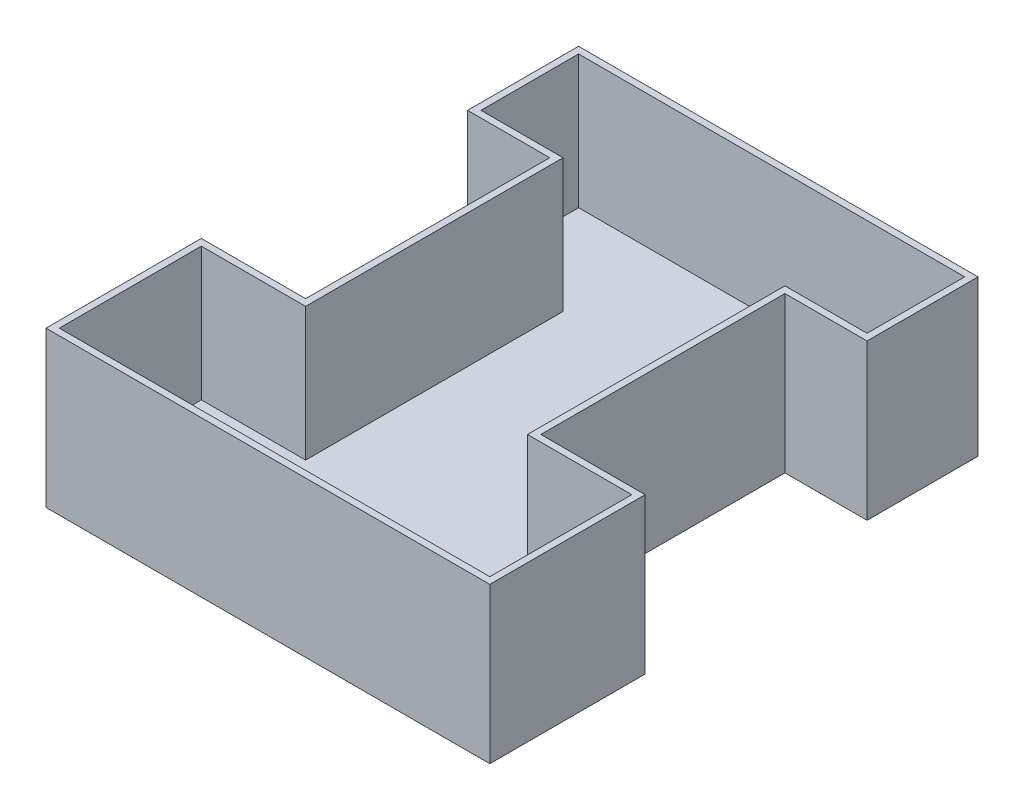
ISO-10303-21;
HEADER;
FILE_DESCRIPTION(('STEP AP214'),'2;1');
FILE_NAME('part.step','',(''),(''),'','','');
FILE_SCHEMA(('AUTOMOTIVE_DESIGN { 1 0 10303 214 1 1 1 1 }'));
ENDSEC;
DATA;
#1=APPLICATION_CONTEXT('core data for automotive mechanical design processes');
#2=APPLICATION_PROTOCOL_DEFINITION('international standard','automotive_design',2000,#1);
#3=PRODUCT_CONTEXT('',#1,'mechanical');
#4=PRODUCT('Part','Part','',(#3));
#5=PRODUCT_RELATED_PRODUCT_CATEGORY('part','',(#4));
#6=PRODUCT_DEFINITION_FORMATION('','',#4);
#7=PRODUCT_DEFINITION_CONTEXT('part definition',#1,'design');
#8=PRODUCT_DEFINITION('design','',#6,#7);
#9=PRODUCT_DEFINITION_SHAPE('','',#8);
#10=(LENGTH_UNIT() NAMED_UNIT(*) SI_UNIT(.MILLI.,.METRE.));
#11=(NAMED_UNIT(*) PLANE_ANGLE_UNIT() SI_UNIT($,.RADIAN.));
#12=(NAMED_UNIT(*) SI_UNIT($,.STERADIAN.) SOLID_ANGLE_UNIT());
#13=UNCERTAINTY_MEASURE_WITH_UNIT(LENGTH_MEASURE(1.E-05),#10,'distance_accuracy_value','');
#14=(GEOMETRIC_REPRESENTATION_CONTEXT(3) GLOBAL_UNCERTAINTY_ASSIGNED_CONTEXT((#13)) GLOBAL_UNIT_ASSIGNED_CONTEXT((#10,
#11,#12)) REPRESENTATION_CONTEXT('',''));
#15=CARTESIAN_POINT('',(0.,0.,0.));
#16=DIRECTION('',(0.,0.,1.));
#17=DIRECTION('',(1.,0.,0.));
#18=AXIS2_PLACEMENT_3D('',#15,#16,#17);
#19=CARTESIAN_POINT('',(0.,60.,0.));
#20=DIRECTION('',(0.,1.,0.));
#21=DIRECTION('',(0.,0.,1.));
#22=AXIS2_PLACEMENT_3D('',#19,#20,#21);
#23=PLANE('',#22);
#24=DIRECTION('',(0.,0.,-1.));
#25=VECTOR('',#24,1.);
#26=CARTESIAN_POINT('',(72.2602739726028,60.,-29.8630136986302));
#27=LINE('',#26,#25);
#28=CARTESIAN_POINT('',(72.2602739726028,60.,-29.8630136986302));
#29=VERTEX_POINT('',#28);
#30=CARTESIAN_POINT('',(72.2602739726028,60.,-79.8630136986302));
#31=VERTEX_POINT('',#30);
#32=EDGE_CURVE('E206',#29,#31,#27,.T.);
#33=ORIENTED_EDGE('',*,*,#32,.T.);
#34=DIRECTION('',(-1.,0.,0.));
#35=VECTOR('',#34,1.);
#36=CARTESIAN_POINT('',(72.2602739726028,60.,-79.8630136986302));
#37=LINE('',#36,#35);
#38=CARTESIAN_POINT('',(-107.739726027397,60.,-79.8630136986302));
#39=VERTEX_POINT('',#38);
#40=EDGE_CURVE('E339',#31,#39,#37,.T.);
#41=ORIENTED_EDGE('',*,*,#40,.T.);
#42=DIRECTION('',(0.,0.,1.));
#43=VECTOR('',#42,1.);
#44=CARTESIAN_POINT('',(-107.739726027397,60.,-79.8630136986302));
#45=LINE('',#44,#43);
#46=CARTESIAN_POINT('',(-107.739726027397,60.,-29.8630136986302));
#47=VERTEX_POINT('',#46);
#48=EDGE_CURVE('E338',#39,#47,#45,.T.);
#49=ORIENTED_EDGE('',*,*,#48,.T.);
#50=DIRECTION('',(1.,0.,0.));
#51=VECTOR('',#50,1.);
#52=CARTESIAN_POINT('',(-107.739726027397,60.,-29.8630136986302));
#53=LINE('',#52,#51);
#54=CARTESIAN_POINT('',(-70.7397260273972,60.,-29.8630136986302));
#55=VERTEX_POINT('',#54);
#56=EDGE_CURVE('E345',#47,#55,#53,.T.);
#57=ORIENTED_EDGE('',*,*,#56,.T.);
#58=DIRECTION('',(0.,0.,1.));
#59=VECTOR('',#58,1.);
#60=CARTESIAN_POINT('',(-70.7397260273972,60.,-29.8630136986302));
#61=LINE('',#60,#59);
#62=CARTESIAN_POINT('',(-70.7397260273972,60.,80.1369863013698));
#63=VERTEX_POINT('',#62);
#64=EDGE_CURVE('E341',#55,#63,#61,.T.);
#65=ORIENTED_EDGE('',*,*,#64,.T.);
#66=DIRECTION('',(-1.,0.,0.));
#67=VECTOR('',#66,1.);
#68=CARTESIAN_POINT('',(-70.7397260273972,60.,80.1369863013698));
#69=LINE('',#68,#67);
#70=CARTESIAN_POINT('',(-117.739726027397,60.,80.1369863013698));
#71=VERTEX_POINT('',#70);
#72=EDGE_CURVE('E347',#63,#71,#69,.T.);
#73=ORIENTED_EDGE('',*,*,#72,.T.);
#74=DIRECTION('',(0.,0.,1.));
#75=VECTOR('',#74,1.);
#76=CARTESIAN_POINT('',(-117.739726027397,60.,80.1369863013698));
#77=LINE('',#76,#75);
#78=CARTESIAN_POINT('',(-117.739726027397,60.,150.13698630137));
#79=VERTEX_POINT('',#78);
#80=EDGE_CURVE('E346',#71,#79,#77,.T.);
#81=ORIENTED_EDGE('',*,*,#80,.T.);
#82=DIRECTION('',(1.,0.,0.));
#83=VECTOR('',#82,1.);
#84=CARTESIAN_POINT('',(-117.739726027397,60.,150.13698630137));
#85=LINE('',#84,#83);
#86=CARTESIAN_POINT('',(82.2602739726028,60.,150.13698630137));
#87=VERTEX_POINT('',#86);
#88=EDGE_CURVE('E348',#79,#87,#85,.T.);
#89=ORIENTED_EDGE('',*,*,#88,.T.);
#90=DIRECTION('',(0.,0.,-1.));
#91=VECTOR('',#90,1.);
#92=CARTESIAN_POINT('',(82.2602739726028,60.,150.13698630137));
#93=LINE('',#92,#91);
#94=CARTESIAN_POINT('',(82.2602739726028,60.,80.1369863013698));
#95=VERTEX_POINT('',#94);
#96=EDGE_CURVE('E355',#87,#95,#93,.T.);
#97=ORIENTED_EDGE('',*,*,#96,.T.);
#98=DIRECTION('',(-1.,0.,0.));
#99=VECTOR('',#98,1.);
#100=CARTESIAN_POINT('',(82.2602739726028,60.,80.1369863013698));
#101=LINE('',#100,#99);
#102=CARTESIAN_POINT('',(35.2602739726028,60.,80.1369863013698));
#103=VERTEX_POINT('',#102);
#104=EDGE_CURVE('E351',#95,#103,#101,.T.);
#105=ORIENTED_EDGE('',*,*,#104,.T.);
#106=DIRECTION('',(0.,0.,-1.));
#107=VECTOR('',#106,1.);
#108=CARTESIAN_POINT('',(35.2602739726028,60.,80.1369863013698));
#109=LINE('',#108,#107);
#110=CARTESIAN_POINT('',(35.2602739726028,60.,-29.8630136986302));
#111=VERTEX_POINT('',#110);
#112=EDGE_CURVE('E357',#103,#111,#109,.T.);
#113=ORIENTED_EDGE('',*,*,#112,.T.);
#114=DIRECTION('',(1.,0.,0.));
#115=VECTOR('',#114,1.);
#116=CARTESIAN_POINT('',(35.2602739726028,60.,-29.8630136986302));
#117=LINE('',#116,#115);
#118=EDGE_CURVE('E61',#111,#29,#117,.T.);
#119=ORIENTED_EDGE('',*,*,#118,.T.);
#120=EDGE_LOOP('',(#33,#41,#49,#57,#65,#73,#81,#89,#97,#105,#113,#119));
#121=FACE_BOUND('',#120,.T.);
#122=DIRECTION('',(-1.,0.,0.));
#123=VECTOR('',#122,1.);
#124=CARTESIAN_POINT('',(69.2602739726028,60.,-76.8630136986302));
#125=LINE('',#124,#123);
#126=CARTESIAN_POINT('',(69.2602739726028,60.,-76.8630136986302));
#127=VERTEX_POINT('',#126);
#128=CARTESIAN_POINT('',(-104.739726027397,60.,-76.8630136986302));
#129=VERTEX_POINT('',#128);
#130=EDGE_CURVE('E258',#127,#129,#125,.T.);
#131=ORIENTED_EDGE('',*,*,#130,.F.);
#132=DIRECTION('',(0.,0.,-1.));
#133=VECTOR('',#132,1.);
#134=CARTESIAN_POINT('',(69.2602739726028,60.,-32.8630136986302));
#135=LINE('',#134,#133);
#136=CARTESIAN_POINT('',(69.2602739726028,60.,-32.8630136986302));
#137=VERTEX_POINT('',#136);
#138=EDGE_CURVE('E255',#137,#127,#135,.T.);
#139=ORIENTED_EDGE('',*,*,#138,.F.);
#140=DIRECTION('',(1.,0.,0.));
#141=VECTOR('',#140,1.);
#142=CARTESIAN_POINT('',(32.2602739726028,60.,-32.8630136986302));
#143=LINE('',#142,#141);
#144=CARTESIAN_POINT('',(32.2602739726028,60.,-32.8630136986302));
#145=VERTEX_POINT('',#144);
#146=EDGE_CURVE('E280',#145,#137,#143,.T.);
#147=ORIENTED_EDGE('',*,*,#146,.F.);
#148=DIRECTION('',(0.,0.,-1.));
#149=VECTOR('',#148,1.);
#150=CARTESIAN_POINT('',(32.2602739726028,60.,83.1369863013698));
#151=LINE('',#150,#149);
#152=CARTESIAN_POINT('',(32.2602739726028,60.,83.1369863013698));
#153=VERTEX_POINT('',#152);
#154=EDGE_CURVE('E274',#153,#145,#151,.T.);
#155=ORIENTED_EDGE('',*,*,#154,.F.);
#156=DIRECTION('',(-1.,0.,0.));
#157=VECTOR('',#156,1.);
#158=CARTESIAN_POINT('',(79.2602739726028,60.,83.1369863013698));
#159=LINE('',#158,#157);
#160=CARTESIAN_POINT('',(79.2602739726028,60.,83.1369863013698));
#161=VERTEX_POINT('',#160);
#162=EDGE_CURVE('E272',#161,#153,#159,.T.);
#163=ORIENTED_EDGE('',*,*,#162,.F.);
#164=DIRECTION('',(0.,0.,-1.));
#165=VECTOR('',#164,1.);
#166=CARTESIAN_POINT('',(79.2602739726028,60.,147.13698630137));
#167=LINE('',#166,#165);
#168=CARTESIAN_POINT('',(79.2602739726028,60.,147.13698630137));
#169=VERTEX_POINT('',#168);
#170=EDGE_CURVE('E271',#169,#161,#167,.T.);
#171=ORIENTED_EDGE('',*,*,#170,.F.);
#172=DIRECTION('',(1.,0.,0.));
#173=VECTOR('',#172,1.);
#174=CARTESIAN_POINT('',(-114.739726027397,60.,147.13698630137));
#175=LINE('',#174,#173);
#176=CARTESIAN_POINT('',(-114.739726027397,60.,147.13698630137));
#177=VERTEX_POINT('',#176);
#178=EDGE_CURVE('E267',#177,#169,#175,.T.);
#179=ORIENTED_EDGE('',*,*,#178,.F.);
#180=DIRECTION('',(0.,0.,1.));
#181=VECTOR('',#180,1.);
#182=CARTESIAN_POINT('',(-114.739726027397,60.,83.1369863013698));
#183=LINE('',#182,#181);
#184=CARTESIAN_POINT('',(-114.739726027397,60.,83.1369863013698));
#185=VERTEX_POINT('',#184);
#186=EDGE_CURVE('E270',#185,#177,#183,.T.);
#187=ORIENTED_EDGE('',*,*,#186,.F.);
#188=DIRECTION('',(-1.,0.,0.));
#189=VECTOR('',#188,1.);
#190=CARTESIAN_POINT('',(-67.7397260273972,60.,83.1369863013698));
#191=LINE('',#190,#189);
#192=CARTESIAN_POINT('',(-67.7397260273972,60.,83.1369863013698));
#193=VERTEX_POINT('',#192);
#194=EDGE_CURVE('E264',#193,#185,#191,.T.);
#195=ORIENTED_EDGE('',*,*,#194,.F.);
#196=DIRECTION('',(0.,0.,1.));
#197=VECTOR('',#196,1.);
#198=CARTESIAN_POINT('',(-67.7397260273972,60.,-32.8630136986302));
#199=LINE('',#198,#197);
#200=CARTESIAN_POINT('',(-67.7397260273972,60.,-32.8630136986302));
#201=VERTEX_POINT('',#200);
#202=EDGE_CURVE('E263',#201,#193,#199,.T.);
#203=ORIENTED_EDGE('',*,*,#202,.F.);
#204=DIRECTION('',(1.,0.,0.));
#205=VECTOR('',#204,1.);
#206=CARTESIAN_POINT('',(-104.739726027397,60.,-32.8630136986302));
#207=LINE('',#206,#205);
#208=CARTESIAN_POINT('',(-104.739726027397,60.,-32.8630136986302));
#209=VERTEX_POINT('',#208);
#210=EDGE_CURVE('E261',#209,#201,#207,.T.);
#211=ORIENTED_EDGE('',*,*,#210,.F.);
#212=DIRECTION('',(0.,0.,1.));
#213=VECTOR('',#212,1.);
#214=CARTESIAN_POINT('',(-104.739726027397,60.,-76.8630136986302));
#215=LINE('',#214,#213);
#216=EDGE_CURVE('E259',#129,#209,#215,.T.);
#217=ORIENTED_EDGE('',*,*,#216,.F.);
#218=EDGE_LOOP('',(#131,#139,#147,#155,#163,#171,#179,#187,#195,#203,#211,#217));
#219=FACE_BOUND('',#218,.T.);
#220=ADVANCED_FACE('F41',(#121,#219),#23,.T.);
#221=CARTESIAN_POINT('',(72.2602739726028,60.,-29.8630136986302));
#222=DIRECTION('',(-1.,0.,0.));
#223=DIRECTION('',(0.,0.,1.));
#224=AXIS2_PLACEMENT_3D('',#221,#222,#223);
#225=PLANE('',#224);
#226=DIRECTION('',(0.,-1.,0.));
#227=VECTOR('',#226,1.);
#228=CARTESIAN_POINT('',(72.2602739726028,60.,-29.8630136986302));
#229=LINE('',#228,#227);
#230=CARTESIAN_POINT('',(72.2602739726028,-10.,-29.8630136986302));
#231=VERTEX_POINT('',#230);
#232=EDGE_CURVE('E205',#29,#231,#229,.T.);
#233=ORIENTED_EDGE('',*,*,#232,.T.);
#234=DIRECTION('',(0.,0.,-1.));
#235=VECTOR('',#234,1.);
#236=CARTESIAN_POINT('',(72.2602739726028,-10.,-29.8630136986302));
#237=LINE('',#236,#235);
#238=CARTESIAN_POINT('',(72.2602739726028,-10.,-79.8630136986302));
#239=VERTEX_POINT('',#238);
#240=EDGE_CURVE('E202',#231,#239,#237,.T.);
#241=ORIENTED_EDGE('',*,*,#240,.T.);
#242=DIRECTION('',(0.,-1.,0.));
#243=VECTOR('',#242,1.);
#244=CARTESIAN_POINT('',(72.2602739726028,60.,-79.8630136986302));
#245=LINE('',#244,#243);
#246=EDGE_CURVE('E11',#31,#239,#245,.T.);
#247=ORIENTED_EDGE('',*,*,#246,.F.);
#248=ORIENTED_EDGE('',*,*,#32,.F.);
#249=EDGE_LOOP('',(#233,#241,#247,#248));
#250=FACE_BOUND('',#249,.T.);
#251=ADVANCED_FACE('F43',(#250),#225,.F.);
#252=CARTESIAN_POINT('',(72.2602739726028,60.,-79.8630136986302));
#253=DIRECTION('',(0.,0.,1.));
#254=DIRECTION('',(1.,0.,0.));
#255=AXIS2_PLACEMENT_3D('',#252,#253,#254);
#256=PLANE('',#255);
#257=ORIENTED_EDGE('',*,*,#246,.T.);
#258=DIRECTION('',(-1.,0.,0.));
#259=VECTOR('',#258,1.);
#260=CARTESIAN_POINT('',(72.2602739726028,-10.,-79.8630136986302));
#261=LINE('',#260,#259);
#262=CARTESIAN_POINT('',(-107.739726027397,-10.,-79.8630136986302));
#263=VERTEX_POINT('',#262);
#264=EDGE_CURVE('E219',#239,#263,#261,.T.);
#265=ORIENTED_EDGE('',*,*,#264,.T.);
#266=DIRECTION('',(0.,-1.,0.));
#267=VECTOR('',#266,1.);
#268=CARTESIAN_POINT('',(-107.739726027397,60.,-79.8630136986302));
#269=LINE('',#268,#267);
#270=EDGE_CURVE('E47',#39,#263,#269,.T.);
#271=ORIENTED_EDGE('',*,*,#270,.F.);
#272=ORIENTED_EDGE('',*,*,#40,.F.);
#273=EDGE_LOOP('',(#257,#265,#271,#272));
#274=FACE_BOUND('',#273,.T.);
#275=ADVANCED_FACE('F382',(#274),#256,.F.);
#276=CARTESIAN_POINT('',(-107.739726027397,60.,-79.8630136986302));
#277=DIRECTION('',(1.,0.,0.));
#278=DIRECTION('',(0.,0.,-1.));
#279=AXIS2_PLACEMENT_3D('',#276,#277,#278);
#280=PLANE('',#279);
#281=ORIENTED_EDGE('',*,*,#270,.T.);
#282=DIRECTION('',(0.,0.,1.));
#283=VECTOR('',#282,1.);
#284=CARTESIAN_POINT('',(-107.739726027397,-10.,-79.8630136986302));
#285=LINE('',#284,#283);
#286=CARTESIAN_POINT('',(-107.739726027397,-10.,-29.8630136986302));
#287=VERTEX_POINT('',#286);
#288=EDGE_CURVE('E230',#263,#287,#285,.T.);
#289=ORIENTED_EDGE('',*,*,#288,.T.);
#290=DIRECTION('',(0.,-1.,0.));
#291=VECTOR('',#290,1.);
#292=CARTESIAN_POINT('',(-107.739726027397,60.,-29.8630136986302));
#293=LINE('',#292,#291);
#294=EDGE_CURVE('E372',#47,#287,#293,.T.);
#295=ORIENTED_EDGE('',*,*,#294,.F.);
#296=ORIENTED_EDGE('',*,*,#48,.F.);
#297=EDGE_LOOP('',(#281,#289,#295,#296));
#298=FACE_BOUND('',#297,.T.);
#299=ADVANCED_FACE('F378',(#298),#280,.F.);
#300=CARTESIAN_POINT('',(-107.739726027397,60.,-29.8630136986302));
#301=DIRECTION('',(0.,0.,-1.));
#302=DIRECTION('',(-1.,0.,0.));
#303=AXIS2_PLACEMENT_3D('',#300,#301,#302);
#304=PLANE('',#303);
#305=ORIENTED_EDGE('',*,*,#294,.T.);
#306=DIRECTION('',(1.,0.,0.));
#307=VECTOR('',#306,1.);
#308=CARTESIAN_POINT('',(-107.739726027397,-10.,-29.8630136986302));
#309=LINE('',#308,#307);
#310=CARTESIAN_POINT('',(-70.7397260273972,-10.,-29.8630136986302));
#311=VERTEX_POINT('',#310);
#312=EDGE_CURVE('E228',#287,#311,#309,.T.);
#313=ORIENTED_EDGE('',*,*,#312,.T.);
#314=DIRECTION('',(0.,-1.,0.));
#315=VECTOR('',#314,1.);
#316=CARTESIAN_POINT('',(-70.7397260273972,60.,-29.8630136986302));
#317=LINE('',#316,#315);
#318=EDGE_CURVE('E375',#55,#311,#317,.T.);
#319=ORIENTED_EDGE('',*,*,#318,.F.);
#320=ORIENTED_EDGE('',*,*,#56,.F.);
#321=EDGE_LOOP('',(#305,#313,#319,#320));
#322=FACE_BOUND('',#321,.T.);
#323=ADVANCED_FACE('F488',(#322),#304,.F.);
#324=CARTESIAN_POINT('',(-70.7397260273972,60.,-29.8630136986302));
#325=DIRECTION('',(1.,0.,0.));
#326=DIRECTION('',(0.,0.,-1.));
#327=AXIS2_PLACEMENT_3D('',#324,#325,#326);
#328=PLANE('',#327);
#329=ORIENTED_EDGE('',*,*,#318,.T.);
#330=DIRECTION('',(0.,0.,1.));
#331=VECTOR('',#330,1.);
#332=CARTESIAN_POINT('',(-70.7397260273972,-10.,-29.8630136986302));
#333=LINE('',#332,#331);
#334=CARTESIAN_POINT('',(-70.7397260273972,-10.,80.1369863013698));
#335=VERTEX_POINT('',#334);
#336=EDGE_CURVE('E234',#311,#335,#333,.T.);
#337=ORIENTED_EDGE('',*,*,#336,.T.);
#338=DIRECTION('',(0.,-1.,0.));
#339=VECTOR('',#338,1.);
#340=CARTESIAN_POINT('',(-70.7397260273972,60.,80.1369863013698));
#341=LINE('',#340,#339);
#342=EDGE_CURVE('E367',#63,#335,#341,.T.);
#343=ORIENTED_EDGE('',*,*,#342,.F.);
#344=ORIENTED_EDGE('',*,*,#64,.F.);
#345=EDGE_LOOP('',(#329,#337,#343,#344));
#346=FACE_BOUND('',#345,.T.);
#347=ADVANCED_FACE('F482',(#346),#328,.F.);
#348=CARTESIAN_POINT('',(-70.7397260273972,60.,80.1369863013698));
#349=DIRECTION('',(0.,0.,1.));
#350=DIRECTION('',(1.,0.,0.));
#351=AXIS2_PLACEMENT_3D('',#348,#349,#350);
#352=PLANE('',#351);
#353=ORIENTED_EDGE('',*,*,#342,.T.);
#354=DIRECTION('',(-1.,0.,0.));
#355=VECTOR('',#354,1.);
#356=CARTESIAN_POINT('',(-70.7397260273972,-10.,80.1369863013698));
#357=LINE('',#356,#355);
#358=CARTESIAN_POINT('',(-117.739726027397,-10.,80.1369863013698));
#359=VERTEX_POINT('',#358);
#360=EDGE_CURVE('E237',#335,#359,#357,.T.);
#361=ORIENTED_EDGE('',*,*,#360,.T.);
#362=DIRECTION('',(0.,-1.,0.));
#363=VECTOR('',#362,1.);
#364=CARTESIAN_POINT('',(-117.739726027397,60.,80.1369863013698));
#365=LINE('',#364,#363);
#366=EDGE_CURVE('E366',#71,#359,#365,.T.);
#367=ORIENTED_EDGE('',*,*,#366,.F.);
#368=ORIENTED_EDGE('',*,*,#72,.F.);
#369=EDGE_LOOP('',(#353,#361,#367,#368));
#370=FACE_BOUND('',#369,.T.);
#371=ADVANCED_FACE('F477',(#370),#352,.F.);
#372=CARTESIAN_POINT('',(-117.739726027397,60.,80.1369863013698));
#373=DIRECTION('',(1.,0.,0.));
#374=DIRECTION('',(0.,0.,-1.));
#375=AXIS2_PLACEMENT_3D('',#372,#373,#374);
#376=PLANE('',#375);
#377=ORIENTED_EDGE('',*,*,#366,.T.);
#378=DIRECTION('',(0.,0.,1.));
#379=VECTOR('',#378,1.);
#380=CARTESIAN_POINT('',(-117.739726027397,-10.,80.1369863013698));
#381=LINE('',#380,#379);
#382=CARTESIAN_POINT('',(-117.739726027397,-10.,150.13698630137));
#383=VERTEX_POINT('',#382);
#384=EDGE_CURVE('E239',#359,#383,#381,.T.);
#385=ORIENTED_EDGE('',*,*,#384,.T.);
#386=DIRECTION('',(0.,-1.,0.));
#387=VECTOR('',#386,1.);
#388=CARTESIAN_POINT('',(-117.739726027397,60.,150.13698630137));
#389=LINE('',#388,#387);
#390=EDGE_CURVE('E368',#79,#383,#389,.T.);
#391=ORIENTED_EDGE('',*,*,#390,.F.);
#392=ORIENTED_EDGE('',*,*,#80,.F.);
#393=EDGE_LOOP('',(#377,#385,#391,#392));
#394=FACE_BOUND('',#393,.T.);
#395=ADVANCED_FACE('F478',(#394),#376,.F.);
#396=CARTESIAN_POINT('',(-117.739726027397,60.,150.13698630137));
#397=DIRECTION('',(0.,0.,-1.));
#398=DIRECTION('',(-1.,0.,0.));
#399=AXIS2_PLACEMENT_3D('',#396,#397,#398);
#400=PLANE('',#399);
#401=ORIENTED_EDGE('',*,*,#390,.T.);
#402=DIRECTION('',(1.,0.,0.));
#403=VECTOR('',#402,1.);
#404=CARTESIAN_POINT('',(-117.739726027397,-10.,150.13698630137));
#405=LINE('',#404,#403);
#406=CARTESIAN_POINT('',(82.2602739726028,-10.,150.13698630137));
#407=VERTEX_POINT('',#406);
#408=EDGE_CURVE('E245',#383,#407,#405,.T.);
#409=ORIENTED_EDGE('',*,*,#408,.T.);
#410=DIRECTION('',(0.,-1.,0.));
#411=VECTOR('',#410,1.);
#412=CARTESIAN_POINT('',(82.2602739726028,60.,150.13698630137));
#413=LINE('',#412,#411);
#414=EDGE_CURVE('E365',#87,#407,#413,.T.);
#415=ORIENTED_EDGE('',*,*,#414,.F.);
#416=ORIENTED_EDGE('',*,*,#88,.F.);
#417=EDGE_LOOP('',(#401,#409,#415,#416));
#418=FACE_BOUND('',#417,.T.);
#419=ADVANCED_FACE('F472',(#418),#400,.F.);
#420=CARTESIAN_POINT('',(82.2602739726028,60.,150.13698630137));
#421=DIRECTION('',(-1.,0.,0.));
#422=DIRECTION('',(0.,0.,1.));
#423=AXIS2_PLACEMENT_3D('',#420,#421,#422);
#424=PLANE('',#423);
#425=ORIENTED_EDGE('',*,*,#414,.T.);
#426=DIRECTION('',(0.,0.,-1.));
#427=VECTOR('',#426,1.);
#428=CARTESIAN_POINT('',(82.2602739726028,-10.,150.13698630137));
#429=LINE('',#428,#427);
#430=CARTESIAN_POINT('',(82.2602739726028,-10.,80.1369863013698));
#431=VERTEX_POINT('',#430);
#432=EDGE_CURVE('E243',#407,#431,#429,.T.);
#433=ORIENTED_EDGE('',*,*,#432,.T.);
#434=DIRECTION('',(0.,-1.,0.));
#435=VECTOR('',#434,1.);
#436=CARTESIAN_POINT('',(82.2602739726028,60.,80.1369863013698));
#437=LINE('',#436,#435);
#438=EDGE_CURVE('E362',#95,#431,#437,.T.);
#439=ORIENTED_EDGE('',*,*,#438,.F.);
#440=ORIENTED_EDGE('',*,*,#96,.F.);
#441=EDGE_LOOP('',(#425,#433,#439,#440));
#442=FACE_BOUND('',#441,.T.);
#443=ADVANCED_FACE('F469',(#442),#424,.F.);
#444=CARTESIAN_POINT('',(82.2602739726028,60.,80.1369863013698));
#445=DIRECTION('',(0.,0.,1.));
#446=DIRECTION('',(1.,0.,0.));
#447=AXIS2_PLACEMENT_3D('',#444,#445,#446);
#448=PLANE('',#447);
#449=ORIENTED_EDGE('',*,*,#438,.T.);
#450=DIRECTION('',(-1.,0.,0.));
#451=VECTOR('',#450,1.);
#452=CARTESIAN_POINT('',(82.2602739726028,-10.,80.1369863013698));
#453=LINE('',#452,#451);
#454=CARTESIAN_POINT('',(35.2602739726028,-10.,80.1369863013698));
#455=VERTEX_POINT('',#454);
#456=EDGE_CURVE('E249',#431,#455,#453,.T.);
#457=ORIENTED_EDGE('',*,*,#456,.T.);
#458=DIRECTION('',(0.,-1.,0.));
#459=VECTOR('',#458,1.);
#460=CARTESIAN_POINT('',(35.2602739726028,60.,80.1369863013698));
#461=LINE('',#460,#459);
#462=EDGE_CURVE('E358',#103,#455,#461,.T.);
#463=ORIENTED_EDGE('',*,*,#462,.F.);
#464=ORIENTED_EDGE('',*,*,#104,.F.);
#465=EDGE_LOOP('',(#449,#457,#463,#464));
#466=FACE_BOUND('',#465,.T.);
#467=ADVANCED_FACE('F461',(#466),#448,.F.);
#468=CARTESIAN_POINT('',(35.2602739726028,60.,80.1369863013698));
#469=DIRECTION('',(-1.,0.,0.));
#470=DIRECTION('',(0.,0.,1.));
#471=AXIS2_PLACEMENT_3D('',#468,#469,#470);
#472=PLANE('',#471);
#473=ORIENTED_EDGE('',*,*,#462,.T.);
#474=DIRECTION('',(0.,0.,-1.));
#475=VECTOR('',#474,1.);
#476=CARTESIAN_POINT('',(35.2602739726028,-10.,80.1369863013698));
#477=LINE('',#476,#475);
#478=CARTESIAN_POINT('',(35.2602739726028,-10.,-29.8630136986302));
#479=VERTEX_POINT('',#478);
#480=EDGE_CURVE('E253',#455,#479,#477,.T.);
#481=ORIENTED_EDGE('',*,*,#480,.T.);
#482=DIRECTION('',(0.,-1.,0.));
#483=VECTOR('',#482,1.);
#484=CARTESIAN_POINT('',(35.2602739726028,60.,-29.8630136986302));
#485=LINE('',#484,#483);
#486=EDGE_CURVE('E207',#111,#479,#485,.T.);
#487=ORIENTED_EDGE('',*,*,#486,.F.);
#488=ORIENTED_EDGE('',*,*,#112,.F.);
#489=EDGE_LOOP('',(#473,#481,#487,#488));
#490=FACE_BOUND('',#489,.T.);
#491=ADVANCED_FACE('F462',(#490),#472,.F.);
#492=CARTESIAN_POINT('',(35.2602739726028,60.,-29.8630136986302));
#493=DIRECTION('',(0.,0.,-1.));
#494=DIRECTION('',(-1.,0.,0.));
#495=AXIS2_PLACEMENT_3D('',#492,#493,#494);
#496=PLANE('',#495);
#497=ORIENTED_EDGE('',*,*,#486,.T.);
#498=DIRECTION('',(1.,0.,0.));
#499=VECTOR('',#498,1.);
#500=CARTESIAN_POINT('',(35.2602739726028,-10.,-29.8630136986302));
#501=LINE('',#500,#499);
#502=EDGE_CURVE('E216',#479,#231,#501,.T.);
#503=ORIENTED_EDGE('',*,*,#502,.T.);
#504=ORIENTED_EDGE('',*,*,#232,.F.);
#505=ORIENTED_EDGE('',*,*,#118,.F.);
#506=EDGE_LOOP('',(#497,#503,#504,#505));
#507=FACE_BOUND('',#506,.T.);
#508=ADVANCED_FACE('F225',(#507),#496,.F.);
#509=CARTESIAN_POINT('',(69.2602739726028,60.,-32.8630136986302));
#510=DIRECTION('',(-1.,0.,0.));
#511=DIRECTION('',(0.,0.,1.));
#512=AXIS2_PLACEMENT_3D('',#509,#510,#511);
#513=PLANE('',#512);
#514=DIRECTION('',(0.,0.,-1.));
#515=VECTOR('',#514,1.);
#516=CARTESIAN_POINT('',(69.2602739726028,0.,-32.8630136986302));
#517=LINE('',#516,#515);
#518=CARTESIAN_POINT('',(69.2602739726028,0.,-32.8630136986302));
#519=VERTEX_POINT('',#518);
#520=CARTESIAN_POINT('',(69.2602739726028,0.,-76.8630136986302));
#521=VERTEX_POINT('',#520);
#522=EDGE_CURVE('E251',#519,#521,#517,.T.);
#523=ORIENTED_EDGE('',*,*,#522,.F.);
#524=DIRECTION('',(0.,-1.,0.));
#525=VECTOR('',#524,1.);
#526=CARTESIAN_POINT('',(69.2602739726028,60.,-32.8630136986302));
#527=LINE('',#526,#525);
#528=EDGE_CURVE('E276',#137,#519,#527,.T.);
#529=ORIENTED_EDGE('',*,*,#528,.F.);
#530=ORIENTED_EDGE('',*,*,#138,.T.);
#531=DIRECTION('',(0.,-1.,0.));
#532=VECTOR('',#531,1.);
#533=CARTESIAN_POINT('',(69.2602739726028,60.,-76.8630136986302));
#534=LINE('',#533,#532);
#535=EDGE_CURVE('E331',#127,#521,#534,.T.);
#536=ORIENTED_EDGE('',*,*,#535,.T.);
#537=EDGE_LOOP('',(#523,#529,#530,#536));
#538=FACE_BOUND('',#537,.T.);
#539=ADVANCED_FACE('F403',(#538),#513,.T.);
#540=CARTESIAN_POINT('',(69.2602739726028,60.,-76.8630136986302));
#541=DIRECTION('',(0.,0.,1.));
#542=DIRECTION('',(1.,0.,0.));
#543=AXIS2_PLACEMENT_3D('',#540,#541,#542);
#544=PLANE('',#543);
#545=DIRECTION('',(-1.,0.,0.));
#546=VECTOR('',#545,1.);
#547=CARTESIAN_POINT('',(69.2602739726028,0.,-76.8630136986302));
#548=LINE('',#547,#546);
#549=CARTESIAN_POINT('',(-104.739726027397,0.,-76.8630136986302));
#550=VERTEX_POINT('',#549);
#551=EDGE_CURVE('E285',#521,#550,#548,.T.);
#552=ORIENTED_EDGE('',*,*,#551,.F.);
#553=ORIENTED_EDGE('',*,*,#535,.F.);
#554=ORIENTED_EDGE('',*,*,#130,.T.);
#555=DIRECTION('',(0.,-1.,0.));
#556=VECTOR('',#555,1.);
#557=CARTESIAN_POINT('',(-104.739726027397,60.,-76.8630136986302));
#558=LINE('',#557,#556);
#559=EDGE_CURVE('E335',#129,#550,#558,.T.);
#560=ORIENTED_EDGE('',*,*,#559,.T.);
#561=EDGE_LOOP('',(#552,#553,#554,#560));
#562=FACE_BOUND('',#561,.T.);
#563=ADVANCED_FACE('F393',(#562),#544,.T.);
#564=CARTESIAN_POINT('',(-104.739726027397,60.,-76.8630136986302));
#565=DIRECTION('',(1.,0.,0.));
#566=DIRECTION('',(0.,0.,-1.));
#567=AXIS2_PLACEMENT_3D('',#564,#565,#566);
#568=PLANE('',#567);
#569=DIRECTION('',(0.,0.,1.));
#570=VECTOR('',#569,1.);
#571=CARTESIAN_POINT('',(-104.739726027397,0.,-76.8630136986302));
#572=LINE('',#571,#570);
#573=CARTESIAN_POINT('',(-104.739726027397,0.,-32.8630136986302));
#574=VERTEX_POINT('',#573);
#575=EDGE_CURVE('E283',#550,#574,#572,.T.);
#576=ORIENTED_EDGE('',*,*,#575,.F.);
#577=ORIENTED_EDGE('',*,*,#559,.F.);
#578=ORIENTED_EDGE('',*,*,#216,.T.);
#579=DIRECTION('',(0.,-1.,0.));
#580=VECTOR('',#579,1.);
#581=CARTESIAN_POINT('',(-104.739726027397,60.,-32.8630136986302));
#582=LINE('',#581,#580);
#583=EDGE_CURVE('E329',#209,#574,#582,.T.);
#584=ORIENTED_EDGE('',*,*,#583,.T.);
#585=EDGE_LOOP('',(#576,#577,#578,#584));
#586=FACE_BOUND('',#585,.T.);
#587=ADVANCED_FACE('F399',(#586),#568,.T.);
#588=CARTESIAN_POINT('',(-104.739726027397,60.,-32.8630136986302));
#589=DIRECTION('',(0.,0.,-1.));
#590=DIRECTION('',(-1.,0.,0.));
#591=AXIS2_PLACEMENT_3D('',#588,#589,#590);
#592=PLANE('',#591);
#593=DIRECTION('',(1.,0.,0.));
#594=VECTOR('',#593,1.);
#595=CARTESIAN_POINT('',(-104.739726027397,0.,-32.8630136986302));
#596=LINE('',#595,#594);
#597=CARTESIAN_POINT('',(-67.7397260273972,0.,-32.8630136986302));
#598=VERTEX_POINT('',#597);
#599=EDGE_CURVE('E289',#574,#598,#596,.T.);
#600=ORIENTED_EDGE('',*,*,#599,.F.);
#601=ORIENTED_EDGE('',*,*,#583,.F.);
#602=ORIENTED_EDGE('',*,*,#210,.T.);
#603=DIRECTION('',(0.,-1.,0.));
#604=VECTOR('',#603,1.);
#605=CARTESIAN_POINT('',(-67.7397260273972,60.,-32.8630136986302));
#606=LINE('',#605,#604);
#607=EDGE_CURVE('E327',#201,#598,#606,.T.);
#608=ORIENTED_EDGE('',*,*,#607,.T.);
#609=EDGE_LOOP('',(#600,#601,#602,#608));
#610=FACE_BOUND('',#609,.T.);
#611=ADVANCED_FACE('F441',(#610),#592,.T.);
#612=CARTESIAN_POINT('',(-67.7397260273972,60.,-32.8630136986302));
#613=DIRECTION('',(1.,0.,0.));
#614=DIRECTION('',(0.,0.,-1.));
#615=AXIS2_PLACEMENT_3D('',#612,#613,#614);
#616=PLANE('',#615);
#617=DIRECTION('',(0.,0.,1.));
#618=VECTOR('',#617,1.);
#619=CARTESIAN_POINT('',(-67.7397260273972,0.,-32.8630136986302));
#620=LINE('',#619,#618);
#621=CARTESIAN_POINT('',(-67.7397260273972,0.,83.1369863013698));
#622=VERTEX_POINT('',#621);
#623=EDGE_CURVE('E292',#598,#622,#620,.T.);
#624=ORIENTED_EDGE('',*,*,#623,.F.);
#625=ORIENTED_EDGE('',*,*,#607,.F.);
#626=ORIENTED_EDGE('',*,*,#202,.T.);
#627=DIRECTION('',(0.,-1.,0.));
#628=VECTOR('',#627,1.);
#629=CARTESIAN_POINT('',(-67.7397260273972,60.,83.1369863013698));
#630=LINE('',#629,#628);
#631=EDGE_CURVE('E326',#193,#622,#630,.T.);
#632=ORIENTED_EDGE('',*,*,#631,.T.);
#633=EDGE_LOOP('',(#624,#625,#626,#632));
#634=FACE_BOUND('',#633,.T.);
#635=ADVANCED_FACE('F445',(#634),#616,.T.);
#636=CARTESIAN_POINT('',(-67.7397260273972,60.,83.1369863013698));
#637=DIRECTION('',(0.,0.,1.));
#638=DIRECTION('',(1.,0.,0.));
#639=AXIS2_PLACEMENT_3D('',#636,#637,#638);
#640=PLANE('',#639);
#641=DIRECTION('',(-1.,0.,0.));
#642=VECTOR('',#641,1.);
#643=CARTESIAN_POINT('',(-67.7397260273972,0.,83.1369863013698));
#644=LINE('',#643,#642);
#645=CARTESIAN_POINT('',(-114.739726027397,0.,83.1369863013698));
#646=VERTEX_POINT('',#645);
#647=EDGE_CURVE('E294',#622,#646,#644,.T.);
#648=ORIENTED_EDGE('',*,*,#647,.F.);
#649=ORIENTED_EDGE('',*,*,#631,.F.);
#650=ORIENTED_EDGE('',*,*,#194,.T.);
#651=DIRECTION('',(0.,-1.,0.));
#652=VECTOR('',#651,1.);
#653=CARTESIAN_POINT('',(-114.739726027397,60.,83.1369863013698));
#654=LINE('',#653,#652);
#655=EDGE_CURVE('E322',#185,#646,#654,.T.);
#656=ORIENTED_EDGE('',*,*,#655,.T.);
#657=EDGE_LOOP('',(#648,#649,#650,#656));
#658=FACE_BOUND('',#657,.T.);
#659=ADVANCED_FACE('F436',(#658),#640,.T.);
#660=CARTESIAN_POINT('',(-114.739726027397,60.,83.1369863013698));
#661=DIRECTION('',(1.,0.,0.));
#662=DIRECTION('',(0.,0.,-1.));
#663=AXIS2_PLACEMENT_3D('',#660,#661,#662);
#664=PLANE('',#663);
#665=DIRECTION('',(0.,0.,1.));
#666=VECTOR('',#665,1.);
#667=CARTESIAN_POINT('',(-114.739726027397,0.,83.1369863013698));
#668=LINE('',#667,#666);
#669=CARTESIAN_POINT('',(-114.739726027397,0.,147.13698630137));
#670=VERTEX_POINT('',#669);
#671=EDGE_CURVE('E300',#646,#670,#668,.T.);
#672=ORIENTED_EDGE('',*,*,#671,.F.);
#673=ORIENTED_EDGE('',*,*,#655,.F.);
#674=ORIENTED_EDGE('',*,*,#186,.T.);
#675=DIRECTION('',(0.,-1.,0.));
#676=VECTOR('',#675,1.);
#677=CARTESIAN_POINT('',(-114.739726027397,60.,147.13698630137));
#678=LINE('',#677,#676);
#679=EDGE_CURVE('E325',#177,#670,#678,.T.);
#680=ORIENTED_EDGE('',*,*,#679,.T.);
#681=EDGE_LOOP('',(#672,#673,#674,#680));
#682=FACE_BOUND('',#681,.T.);
#683=ADVANCED_FACE('F435',(#682),#664,.T.);
#684=CARTESIAN_POINT('',(-114.739726027397,60.,147.13698630137));
#685=DIRECTION('',(0.,0.,-1.));
#686=DIRECTION('',(-1.,0.,0.));
#687=AXIS2_PLACEMENT_3D('',#684,#685,#686);
#688=PLANE('',#687);
#689=DIRECTION('',(1.,0.,0.));
#690=VECTOR('',#689,1.);
#691=CARTESIAN_POINT('',(-114.739726027397,0.,147.13698630137));
#692=LINE('',#691,#690);
#693=CARTESIAN_POINT('',(79.2602739726028,0.,147.13698630137));
#694=VERTEX_POINT('',#693);
#695=EDGE_CURVE('E298',#670,#694,#692,.T.);
#696=ORIENTED_EDGE('',*,*,#695,.F.);
#697=ORIENTED_EDGE('',*,*,#679,.F.);
#698=ORIENTED_EDGE('',*,*,#178,.T.);
#699=DIRECTION('',(0.,-1.,0.));
#700=VECTOR('',#699,1.);
#701=CARTESIAN_POINT('',(79.2602739726028,60.,147.13698630137));
#702=LINE('',#701,#700);
#703=EDGE_CURVE('E319',#169,#694,#702,.T.);
#704=ORIENTED_EDGE('',*,*,#703,.T.);
#705=EDGE_LOOP('',(#696,#697,#698,#704));
#706=FACE_BOUND('',#705,.T.);
#707=ADVANCED_FACE('F427',(#706),#688,.T.);
#708=CARTESIAN_POINT('',(79.2602739726028,60.,147.13698630137));
#709=DIRECTION('',(-1.,0.,0.));
#710=DIRECTION('',(0.,0.,1.));
#711=AXIS2_PLACEMENT_3D('',#708,#709,#710);
#712=PLANE('',#711);
#713=DIRECTION('',(0.,0.,-1.));
#714=VECTOR('',#713,1.);
#715=CARTESIAN_POINT('',(79.2602739726028,0.,147.13698630137));
#716=LINE('',#715,#714);
#717=CARTESIAN_POINT('',(79.2602739726028,0.,83.1369863013698));
#718=VERTEX_POINT('',#717);
#719=EDGE_CURVE('E304',#694,#718,#716,.T.);
#720=ORIENTED_EDGE('',*,*,#719,.F.);
#721=ORIENTED_EDGE('',*,*,#703,.F.);
#722=ORIENTED_EDGE('',*,*,#170,.T.);
#723=DIRECTION('',(0.,-1.,0.));
#724=VECTOR('',#723,1.);
#725=CARTESIAN_POINT('',(79.2602739726028,60.,83.1369863013698));
#726=LINE('',#725,#724);
#727=EDGE_CURVE('E318',#161,#718,#726,.T.);
#728=ORIENTED_EDGE('',*,*,#727,.T.);
#729=EDGE_LOOP('',(#720,#721,#722,#728));
#730=FACE_BOUND('',#729,.T.);
#731=ADVANCED_FACE('F423',(#730),#712,.T.);
#732=CARTESIAN_POINT('',(79.2602739726028,60.,83.1369863013698));
#733=DIRECTION('',(0.,0.,1.));
#734=DIRECTION('',(1.,0.,0.));
#735=AXIS2_PLACEMENT_3D('',#732,#733,#734);
#736=PLANE('',#735);
#737=DIRECTION('',(-1.,0.,0.));
#738=VECTOR('',#737,1.);
#739=CARTESIAN_POINT('',(79.2602739726028,0.,83.1369863013698));
#740=LINE('',#739,#738);
#741=CARTESIAN_POINT('',(32.2602739726028,0.,83.1369863013698));
#742=VERTEX_POINT('',#741);
#743=EDGE_CURVE('E308',#718,#742,#740,.T.);
#744=ORIENTED_EDGE('',*,*,#743,.F.);
#745=ORIENTED_EDGE('',*,*,#727,.F.);
#746=ORIENTED_EDGE('',*,*,#162,.T.);
#747=DIRECTION('',(0.,-1.,0.));
#748=VECTOR('',#747,1.);
#749=CARTESIAN_POINT('',(32.2602739726028,60.,83.1369863013698));
#750=LINE('',#749,#748);
#751=EDGE_CURVE('E316',#153,#742,#750,.T.);
#752=ORIENTED_EDGE('',*,*,#751,.T.);
#753=EDGE_LOOP('',(#744,#745,#746,#752));
#754=FACE_BOUND('',#753,.T.);
#755=ADVANCED_FACE('F417',(#754),#736,.T.);
#756=CARTESIAN_POINT('',(32.2602739726028,60.,83.1369863013698));
#757=DIRECTION('',(-1.,0.,0.));
#758=DIRECTION('',(0.,0.,1.));
#759=AXIS2_PLACEMENT_3D('',#756,#757,#758);
#760=PLANE('',#759);
#761=DIRECTION('',(0.,0.,-1.));
#762=VECTOR('',#761,1.);
#763=CARTESIAN_POINT('',(32.2602739726028,0.,83.1369863013698));
#764=LINE('',#763,#762);
#765=CARTESIAN_POINT('',(32.2602739726028,0.,-32.8630136986302));
#766=VERTEX_POINT('',#765);
#767=EDGE_CURVE('E310',#742,#766,#764,.T.);
#768=ORIENTED_EDGE('',*,*,#767,.F.);
#769=ORIENTED_EDGE('',*,*,#751,.F.);
#770=ORIENTED_EDGE('',*,*,#154,.T.);
#771=DIRECTION('',(0.,-1.,0.));
#772=VECTOR('',#771,1.);
#773=CARTESIAN_POINT('',(32.2602739726028,60.,-32.8630136986302));
#774=LINE('',#773,#772);
#775=EDGE_CURVE('E57',#145,#766,#774,.T.);
#776=ORIENTED_EDGE('',*,*,#775,.T.);
#777=EDGE_LOOP('',(#768,#769,#770,#776));
#778=FACE_BOUND('',#777,.T.);
#779=ADVANCED_FACE('F411',(#778),#760,.T.);
#780=CARTESIAN_POINT('',(32.2602739726028,60.,-32.8630136986302));
#781=DIRECTION('',(0.,0.,-1.));
#782=DIRECTION('',(-1.,0.,0.));
#783=AXIS2_PLACEMENT_3D('',#780,#781,#782);
#784=PLANE('',#783);
#785=DIRECTION('',(1.,0.,0.));
#786=VECTOR('',#785,1.);
#787=CARTESIAN_POINT('',(32.2602739726028,0.,-32.8630136986302));
#788=LINE('',#787,#786);
#789=EDGE_CURVE('E260',#766,#519,#788,.T.);
#790=ORIENTED_EDGE('',*,*,#789,.F.);
#791=ORIENTED_EDGE('',*,*,#775,.F.);
#792=ORIENTED_EDGE('',*,*,#146,.T.);
#793=ORIENTED_EDGE('',*,*,#528,.T.);
#794=EDGE_LOOP('',(#790,#791,#792,#793));
#795=FACE_BOUND('',#794,.T.);
#796=ADVANCED_FACE('F410',(#795),#784,.T.);
#797=CARTESIAN_POINT('',(0.,0.,0.));
#798=DIRECTION('',(0.,1.,0.));
#799=DIRECTION('',(0.,0.,1.));
#800=AXIS2_PLACEMENT_3D('',#797,#798,#799);
#801=PLANE('',#800);
#802=ORIENTED_EDGE('',*,*,#789,.T.);
#803=ORIENTED_EDGE('',*,*,#522,.T.);
#804=ORIENTED_EDGE('',*,*,#551,.T.);
#805=ORIENTED_EDGE('',*,*,#575,.T.);
#806=ORIENTED_EDGE('',*,*,#599,.T.);
#807=ORIENTED_EDGE('',*,*,#623,.T.);
#808=ORIENTED_EDGE('',*,*,#647,.T.);
#809=ORIENTED_EDGE('',*,*,#671,.T.);
#810=ORIENTED_EDGE('',*,*,#695,.T.);
#811=ORIENTED_EDGE('',*,*,#719,.T.);
#812=ORIENTED_EDGE('',*,*,#743,.T.);
#813=ORIENTED_EDGE('',*,*,#767,.T.);
#814=EDGE_LOOP('',(#802,#803,#804,#805,#806,#807,#808,#809,#810,#811,#812,#813));
#815=FACE_BOUND('',#814,.T.);
#816=ADVANCED_FACE('F405',(#815),#801,.T.);
#817=CARTESIAN_POINT('',(0.,-10.,0.));
#818=DIRECTION('',(0.,1.,0.));
#819=DIRECTION('',(0.,0.,1.));
#820=AXIS2_PLACEMENT_3D('',#817,#818,#819);
#821=PLANE('',#820);
#822=ORIENTED_EDGE('',*,*,#502,.F.);
#823=ORIENTED_EDGE('',*,*,#480,.F.);
#824=ORIENTED_EDGE('',*,*,#456,.F.);
#825=ORIENTED_EDGE('',*,*,#432,.F.);
#826=ORIENTED_EDGE('',*,*,#408,.F.);
#827=ORIENTED_EDGE('',*,*,#384,.F.);
#828=ORIENTED_EDGE('',*,*,#360,.F.);
#829=ORIENTED_EDGE('',*,*,#336,.F.);
#830=ORIENTED_EDGE('',*,*,#312,.F.);
#831=ORIENTED_EDGE('',*,*,#288,.F.);
#832=ORIENTED_EDGE('',*,*,#264,.F.);
#833=ORIENTED_EDGE('',*,*,#240,.F.);
#834=EDGE_LOOP('',(#822,#823,#824,#825,#826,#827,#828,#829,#830,#831,#832,#833));
#835=FACE_BOUND('',#834,.T.);
#836=ADVANCED_FACE('F212',(#835),#821,.F.);
#837=CLOSED_SHELL('',(#220,#251,#275,#299,#323,#347,#371,#395,#419,#443,#467,#491,#508,#539,
#563,#587,#611,#635,#659,#683,#707,#731,#755,#779,#796,#816,#836));
#838=MANIFOLD_SOLID_BREP('B2',#837);
#839=ADVANCED_BREP_SHAPE_REPRESENTATION('',(#18,#838),#14);
#840=SHAPE_DEFINITION_REPRESENTATION(#9,#839);
ENDSEC;
END-ISO-10303-21;
